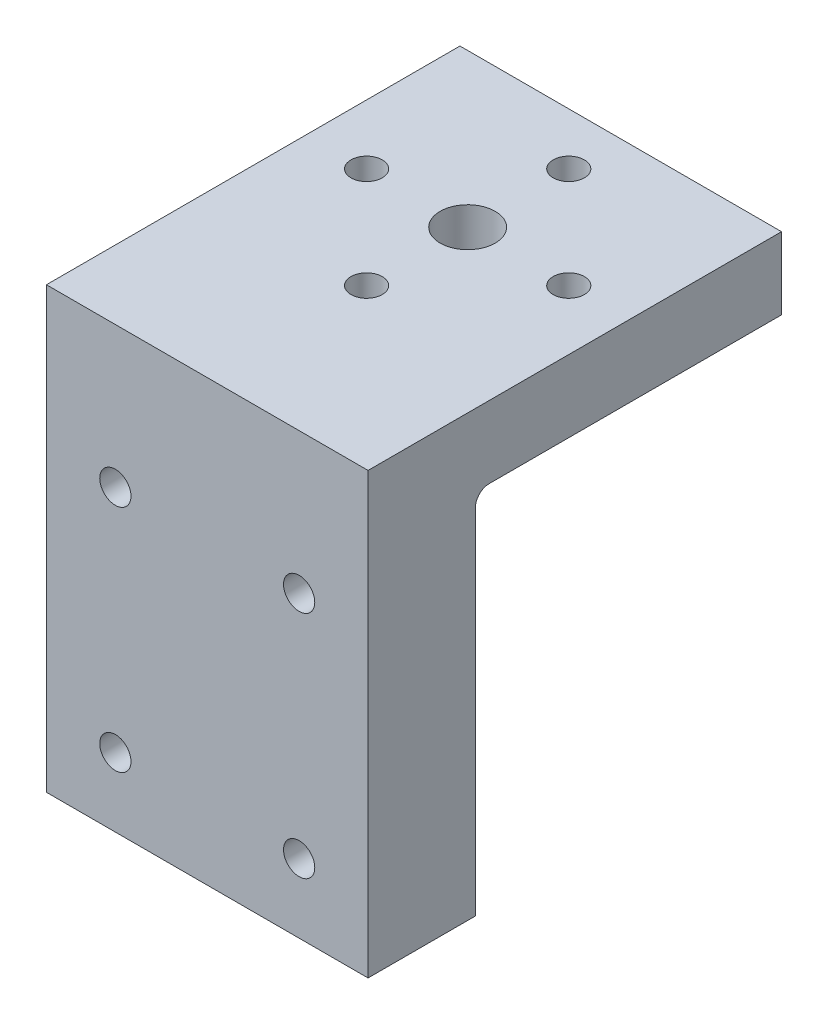
ISO-10303-21;
HEADER;
FILE_DESCRIPTION(('STEP AP214'),'2;1');
FILE_NAME('part.step','',(''),(''),'','','');
FILE_SCHEMA(('AUTOMOTIVE_DESIGN { 1 0 10303 214 1 1 1 1 }'));
ENDSEC;
DATA;
#1=APPLICATION_CONTEXT('core data for automotive mechanical design processes');
#2=APPLICATION_PROTOCOL_DEFINITION('international standard','automotive_design',2000,#1);
#3=PRODUCT_CONTEXT('',#1,'mechanical');
#4=PRODUCT('Part','Part','',(#3));
#5=PRODUCT_RELATED_PRODUCT_CATEGORY('part','',(#4));
#6=PRODUCT_DEFINITION_FORMATION('','',#4);
#7=PRODUCT_DEFINITION_CONTEXT('part definition',#1,'design');
#8=PRODUCT_DEFINITION('design','',#6,#7);
#9=PRODUCT_DEFINITION_SHAPE('','',#8);
#10=(LENGTH_UNIT() NAMED_UNIT(*) SI_UNIT(.MILLI.,.METRE.));
#11=(NAMED_UNIT(*) PLANE_ANGLE_UNIT() SI_UNIT($,.RADIAN.));
#12=(NAMED_UNIT(*) SI_UNIT($,.STERADIAN.) SOLID_ANGLE_UNIT());
#13=UNCERTAINTY_MEASURE_WITH_UNIT(LENGTH_MEASURE(1.E-05),#10,'distance_accuracy_value','');
#14=(GEOMETRIC_REPRESENTATION_CONTEXT(3) GLOBAL_UNCERTAINTY_ASSIGNED_CONTEXT((#13)) GLOBAL_UNIT_ASSIGNED_CONTEXT((#10,
#11,#12)) REPRESENTATION_CONTEXT('',''));
#15=CARTESIAN_POINT('',(0.,0.,0.));
#16=DIRECTION('',(0.,0.,1.));
#17=DIRECTION('',(1.,0.,0.));
#18=AXIS2_PLACEMENT_3D('',#15,#16,#17);
#19=CARTESIAN_POINT('',(17.5,-7.83844459402521,22.5));
#20=DIRECTION('',(1.,0.,0.));
#21=DIRECTION('',(0.,0.,-1.));
#22=AXIS2_PLACEMENT_3D('',#19,#20,#21);
#23=PLANE('',#22);
#24=DIRECTION('',(0.,0.,-1.));
#25=VECTOR('',#24,1.);
#26=CARTESIAN_POINT('',(17.5,0.,22.5));
#27=LINE('',#26,#25);
#28=CARTESIAN_POINT('',(17.5,0.,22.5));
#29=VERTEX_POINT('',#28);
#30=CARTESIAN_POINT('',(17.5,0.,-22.5));
#31=VERTEX_POINT('',#30);
#32=EDGE_CURVE('E133',#29,#31,#27,.T.);
#33=ORIENTED_EDGE('',*,*,#32,.F.);
#34=DIRECTION('',(0.,1.,0.));
#35=VECTOR('',#34,1.);
#36=CARTESIAN_POINT('',(17.5,-7.83844459402521,22.5));
#37=LINE('',#36,#35);
#38=CARTESIAN_POINT('',(17.5,-47.8384445940252,22.5));
#39=VERTEX_POINT('',#38);
#40=EDGE_CURVE('E165',#39,#29,#37,.T.);
#41=ORIENTED_EDGE('',*,*,#40,.F.);
#42=DIRECTION('',(0.,0.,1.));
#43=VECTOR('',#42,1.);
#44=CARTESIAN_POINT('',(17.5,-47.8384445940252,22.5));
#45=LINE('',#44,#43);
#46=CARTESIAN_POINT('',(17.5,-47.8384445940252,10.8151366999293));
#47=VERTEX_POINT('',#46);
#48=EDGE_CURVE('E117',#47,#39,#45,.T.);
#49=ORIENTED_EDGE('',*,*,#48,.F.);
#50=DIRECTION('',(0.,1.,0.));
#51=VECTOR('',#50,1.);
#52=CARTESIAN_POINT('',(17.5,-47.8384445940252,10.8151366999293));
#53=LINE('',#52,#51);
#54=CARTESIAN_POINT('',(17.5,-9.33844459402521,10.8151366999293));
#55=VERTEX_POINT('',#54);
#56=EDGE_CURVE('E112',#47,#55,#53,.T.);
#57=ORIENTED_EDGE('',*,*,#56,.T.);
#58=CARTESIAN_POINT('',(17.5,-9.33844459402521,9.31513669992926));
#59=DIRECTION('',(1.,0.,0.));
#60=DIRECTION('',(0.,0.,-1.));
#61=AXIS2_PLACEMENT_3D('',#58,#59,#60);
#62=CIRCLE('',#61,1.5);
#63=CARTESIAN_POINT('',(17.5,-7.83844459402521,9.31513669992926));
#64=VERTEX_POINT('',#63);
#65=EDGE_CURVE('E55',#55,#64,#62,.F.);
#66=ORIENTED_EDGE('',*,*,#65,.T.);
#67=DIRECTION('',(0.,0.,-1.));
#68=VECTOR('',#67,1.);
#69=CARTESIAN_POINT('',(17.5,-7.83844459402521,22.5));
#70=LINE('',#69,#68);
#71=CARTESIAN_POINT('',(17.5,-7.83844459402521,-22.5));
#72=VERTEX_POINT('',#71);
#73=EDGE_CURVE('E143',#64,#72,#70,.T.);
#74=ORIENTED_EDGE('',*,*,#73,.T.);
#75=DIRECTION('',(0.,1.,0.));
#76=VECTOR('',#75,1.);
#77=CARTESIAN_POINT('',(17.5,-7.83844459402521,-22.5));
#78=LINE('',#77,#76);
#79=EDGE_CURVE('E153',#72,#31,#78,.T.);
#80=ORIENTED_EDGE('',*,*,#79,.T.);
#81=EDGE_LOOP('',(#33,#41,#49,#57,#66,#74,#80));
#82=FACE_BOUND('',#81,.T.);
#83=ADVANCED_FACE('F46',(#82),#23,.T.);
#84=CARTESIAN_POINT('',(-17.5,-7.83844459402521,22.5));
#85=DIRECTION('',(0.,0.,1.));
#86=DIRECTION('',(1.,0.,0.));
#87=AXIS2_PLACEMENT_3D('',#84,#85,#86);
#88=PLANE('',#87);
#89=CARTESIAN_POINT('',(-10.,-40.3384445940252,22.5));
#90=DIRECTION('',(0.,0.,1.));
#91=DIRECTION('',(1.,0.,0.));
#92=AXIS2_PLACEMENT_3D('',#89,#90,#91);
#93=CIRCLE('',#92,1.7);
#94=CARTESIAN_POINT('',(-8.3,-40.3384445940252,22.5));
#95=VERTEX_POINT('',#94);
#96=EDGE_CURVE('E247',#95,#95,#93,.F.);
#97=ORIENTED_EDGE('',*,*,#96,.T.);
#98=EDGE_LOOP('',(#97));
#99=FACE_BOUND('',#98,.T.);
#100=CARTESIAN_POINT('',(10.,-15.3384445940252,22.5));
#101=DIRECTION('',(0.,0.,1.));
#102=DIRECTION('',(1.,0.,0.));
#103=AXIS2_PLACEMENT_3D('',#100,#101,#102);
#104=CIRCLE('',#103,1.7);
#105=CARTESIAN_POINT('',(11.7,-15.3384445940252,22.5));
#106=VERTEX_POINT('',#105);
#107=EDGE_CURVE('E248',#106,#106,#104,.F.);
#108=ORIENTED_EDGE('',*,*,#107,.T.);
#109=EDGE_LOOP('',(#108));
#110=FACE_BOUND('',#109,.T.);
#111=CARTESIAN_POINT('',(-10.,-15.3384445940252,22.5));
#112=DIRECTION('',(0.,0.,1.));
#113=DIRECTION('',(1.,0.,0.));
#114=AXIS2_PLACEMENT_3D('',#111,#112,#113);
#115=CIRCLE('',#114,1.7);
#116=CARTESIAN_POINT('',(-8.3,-15.3384445940252,22.5));
#117=VERTEX_POINT('',#116);
#118=EDGE_CURVE('E262',#117,#117,#115,.F.);
#119=ORIENTED_EDGE('',*,*,#118,.T.);
#120=EDGE_LOOP('',(#119));
#121=FACE_BOUND('',#120,.T.);
#122=CARTESIAN_POINT('',(10.,-40.3384445940252,22.5));
#123=DIRECTION('',(0.,0.,1.));
#124=DIRECTION('',(1.,0.,0.));
#125=AXIS2_PLACEMENT_3D('',#122,#123,#124);
#126=CIRCLE('',#125,1.7);
#127=CARTESIAN_POINT('',(11.7,-40.3384445940252,22.5));
#128=VERTEX_POINT('',#127);
#129=EDGE_CURVE('E228',#128,#128,#126,.F.);
#130=ORIENTED_EDGE('',*,*,#129,.T.);
#131=EDGE_LOOP('',(#130));
#132=FACE_BOUND('',#131,.T.);
#133=DIRECTION('',(1.,0.,0.));
#134=VECTOR('',#133,1.);
#135=CARTESIAN_POINT('',(-17.5,0.,22.5));
#136=LINE('',#135,#134);
#137=CARTESIAN_POINT('',(-17.5,0.,22.5));
#138=VERTEX_POINT('',#137);
#139=EDGE_CURVE('E147',#138,#29,#136,.T.);
#140=ORIENTED_EDGE('',*,*,#139,.F.);
#141=DIRECTION('',(0.,1.,0.));
#142=VECTOR('',#141,1.);
#143=CARTESIAN_POINT('',(-17.5,-7.83844459402521,22.5));
#144=LINE('',#143,#142);
#145=CARTESIAN_POINT('',(-17.5,-47.8384445940252,22.5));
#146=VERTEX_POINT('',#145);
#147=EDGE_CURVE('E169',#146,#138,#144,.T.);
#148=ORIENTED_EDGE('',*,*,#147,.F.);
#149=DIRECTION('',(-1.,0.,0.));
#150=VECTOR('',#149,1.);
#151=CARTESIAN_POINT('',(-17.5,-47.8384445940252,22.5));
#152=LINE('',#151,#150);
#153=EDGE_CURVE('E124',#39,#146,#152,.T.);
#154=ORIENTED_EDGE('',*,*,#153,.F.);
#155=ORIENTED_EDGE('',*,*,#40,.T.);
#156=EDGE_LOOP('',(#140,#148,#154,#155));
#157=FACE_BOUND('',#156,.T.);
#158=ADVANCED_FACE('F267',(#99,#110,#121,#132,#157),#88,.T.);
#159=CARTESIAN_POINT('',(-17.5,-7.83844459402521,22.5));
#160=DIRECTION('',(-1.,0.,0.));
#161=DIRECTION('',(0.,0.,1.));
#162=AXIS2_PLACEMENT_3D('',#159,#160,#161);
#163=PLANE('',#162);
#164=DIRECTION('',(0.,0.,1.));
#165=VECTOR('',#164,1.);
#166=CARTESIAN_POINT('',(-17.5,0.,22.5));
#167=LINE('',#166,#165);
#168=CARTESIAN_POINT('',(-17.5,0.,-22.5));
#169=VERTEX_POINT('',#168);
#170=EDGE_CURVE('E158',#169,#138,#167,.T.);
#171=ORIENTED_EDGE('',*,*,#170,.F.);
#172=DIRECTION('',(0.,1.,0.));
#173=VECTOR('',#172,1.);
#174=CARTESIAN_POINT('',(-17.5,-7.83844459402521,-22.5));
#175=LINE('',#174,#173);
#176=CARTESIAN_POINT('',(-17.5,-7.83844459402521,-22.5));
#177=VERTEX_POINT('',#176);
#178=EDGE_CURVE('E172',#177,#169,#175,.T.);
#179=ORIENTED_EDGE('',*,*,#178,.F.);
#180=DIRECTION('',(0.,0.,1.));
#181=VECTOR('',#180,1.);
#182=CARTESIAN_POINT('',(-17.5,-7.83844459402521,22.5));
#183=LINE('',#182,#181);
#184=CARTESIAN_POINT('',(-17.5,-7.83844459402521,9.31513669992926));
#185=VERTEX_POINT('',#184);
#186=EDGE_CURVE('E151',#177,#185,#183,.T.);
#187=ORIENTED_EDGE('',*,*,#186,.T.);
#188=CARTESIAN_POINT('',(-17.5,-9.33844459402521,9.31513669992926));
#189=DIRECTION('',(-1.,0.,0.));
#190=DIRECTION('',(0.,0.,1.));
#191=AXIS2_PLACEMENT_3D('',#188,#189,#190);
#192=CIRCLE('',#191,1.5);
#193=CARTESIAN_POINT('',(-17.5,-9.33844459402521,10.8151366999293));
#194=VERTEX_POINT('',#193);
#195=EDGE_CURVE('E11',#185,#194,#192,.F.);
#196=ORIENTED_EDGE('',*,*,#195,.T.);
#197=DIRECTION('',(0.,1.,0.));
#198=VECTOR('',#197,1.);
#199=CARTESIAN_POINT('',(-17.5,-47.8384445940252,10.8151366999293));
#200=LINE('',#199,#198);
#201=CARTESIAN_POINT('',(-17.5,-47.8384445940252,10.8151366999293));
#202=VERTEX_POINT('',#201);
#203=EDGE_CURVE('E110',#202,#194,#200,.T.);
#204=ORIENTED_EDGE('',*,*,#203,.F.);
#205=DIRECTION('',(0.,0.,-1.));
#206=VECTOR('',#205,1.);
#207=CARTESIAN_POINT('',(-17.5,-47.8384445940252,22.5));
#208=LINE('',#207,#206);
#209=EDGE_CURVE('E118',#146,#202,#208,.T.);
#210=ORIENTED_EDGE('',*,*,#209,.F.);
#211=ORIENTED_EDGE('',*,*,#147,.T.);
#212=EDGE_LOOP('',(#171,#179,#187,#196,#204,#210,#211));
#213=FACE_BOUND('',#212,.T.);
#214=ADVANCED_FACE('F130',(#213),#163,.T.);
#215=CARTESIAN_POINT('',(-17.5,-7.83844459402521,-22.5));
#216=DIRECTION('',(0.,0.,-1.));
#217=DIRECTION('',(-1.,0.,0.));
#218=AXIS2_PLACEMENT_3D('',#215,#216,#217);
#219=PLANE('',#218);
#220=DIRECTION('',(-1.,0.,0.));
#221=VECTOR('',#220,1.);
#222=CARTESIAN_POINT('',(-17.5,0.,-22.5));
#223=LINE('',#222,#221);
#224=EDGE_CURVE('E138',#31,#169,#223,.T.);
#225=ORIENTED_EDGE('',*,*,#224,.F.);
#226=ORIENTED_EDGE('',*,*,#79,.F.);
#227=DIRECTION('',(-1.,0.,0.));
#228=VECTOR('',#227,1.);
#229=CARTESIAN_POINT('',(-17.5,-7.83844459402521,-22.5));
#230=LINE('',#229,#228);
#231=EDGE_CURVE('E146',#72,#177,#230,.T.);
#232=ORIENTED_EDGE('',*,*,#231,.T.);
#233=ORIENTED_EDGE('',*,*,#178,.T.);
#234=EDGE_LOOP('',(#225,#226,#232,#233));
#235=FACE_BOUND('',#234,.T.);
#236=ADVANCED_FACE('F296',(#235),#219,.T.);
#237=CARTESIAN_POINT('',(0.,-7.83844459402521,0.));
#238=DIRECTION('',(0.,-1.,0.));
#239=DIRECTION('',(0.,0.,-1.));
#240=AXIS2_PLACEMENT_3D('',#237,#238,#239);
#241=PLANE('',#240);
#242=CARTESIAN_POINT('',(0.,-7.83844459402521,5.15756834996463));
#243=DIRECTION('',(0.,-1.,0.));
#244=DIRECTION('',(0.,0.,-1.));
#245=AXIS2_PLACEMENT_3D('',#242,#243,#244);
#246=CIRCLE('',#245,1.7);
#247=CARTESIAN_POINT('',(0.,-7.83844459402521,3.45756834996463));
#248=VERTEX_POINT('',#247);
#249=EDGE_CURVE('E202',#248,#248,#246,.T.);
#250=ORIENTED_EDGE('',*,*,#249,.F.);
#251=EDGE_LOOP('',(#250));
#252=FACE_BOUND('',#251,.T.);
#253=CARTESIAN_POINT('',(11.0000000000001,-7.83844459402521,-5.84243165003525));
#254=DIRECTION('',(0.,-1.,0.));
#255=DIRECTION('',(0.,0.,-1.));
#256=AXIS2_PLACEMENT_3D('',#253,#254,#255);
#257=CIRCLE('',#256,1.7);
#258=CARTESIAN_POINT('',(11.0000000000001,-7.83844459402521,-7.54243165003525));
#259=VERTEX_POINT('',#258);
#260=EDGE_CURVE('E203',#259,#259,#257,.T.);
#261=ORIENTED_EDGE('',*,*,#260,.F.);
#262=EDGE_LOOP('',(#261));
#263=FACE_BOUND('',#262,.T.);
#264=CARTESIAN_POINT('',(2.30437768363647E-13,-7.83844459402521,-16.8424316500354));
#265=DIRECTION('',(0.,-1.,0.));
#266=DIRECTION('',(0.,0.,-1.));
#267=AXIS2_PLACEMENT_3D('',#264,#265,#266);
#268=CIRCLE('',#267,1.7);
#269=CARTESIAN_POINT('',(2.30437768363647E-13,-7.83844459402521,-18.5424316500354));
#270=VERTEX_POINT('',#269);
#271=EDGE_CURVE('E212',#270,#270,#268,.T.);
#272=ORIENTED_EDGE('',*,*,#271,.F.);
#273=EDGE_LOOP('',(#272));
#274=FACE_BOUND('',#273,.T.);
#275=CARTESIAN_POINT('',(-10.9999999999998,-7.83844459402521,-5.84243165003541));
#276=DIRECTION('',(0.,-1.,0.));
#277=DIRECTION('',(0.,0.,-1.));
#278=AXIS2_PLACEMENT_3D('',#275,#276,#277);
#279=CIRCLE('',#278,1.7);
#280=CARTESIAN_POINT('',(-10.9999999999998,-7.83844459402521,-7.54243165003541));
#281=VERTEX_POINT('',#280);
#282=EDGE_CURVE('E219',#281,#281,#279,.T.);
#283=ORIENTED_EDGE('',*,*,#282,.F.);
#284=EDGE_LOOP('',(#283));
#285=FACE_BOUND('',#284,.T.);
#286=CARTESIAN_POINT('',(0.,-7.83844459402521,-5.84243165003537));
#287=DIRECTION('',(0.,-1.,0.));
#288=DIRECTION('',(0.,0.,-1.));
#289=AXIS2_PLACEMENT_3D('',#286,#287,#288);
#290=CIRCLE('',#289,9.);
#291=CARTESIAN_POINT('',(0.,-7.83844459402521,-14.8424316500354));
#292=VERTEX_POINT('',#291);
#293=EDGE_CURVE('E181',#292,#292,#290,.T.);
#294=ORIENTED_EDGE('',*,*,#293,.F.);
#295=EDGE_LOOP('',(#294));
#296=FACE_BOUND('',#295,.T.);
#297=ORIENTED_EDGE('',*,*,#73,.F.);
#298=DIRECTION('',(1.,0.,0.));
#299=VECTOR('',#298,1.);
#300=CARTESIAN_POINT('',(0.,-7.83844459402521,9.31513669992926));
#301=LINE('',#300,#299);
#302=EDGE_CURVE('E68',#64,#185,#301,.F.);
#303=ORIENTED_EDGE('',*,*,#302,.T.);
#304=ORIENTED_EDGE('',*,*,#186,.F.);
#305=ORIENTED_EDGE('',*,*,#231,.F.);
#306=EDGE_LOOP('',(#297,#303,#304,#305));
#307=FACE_BOUND('',#306,.T.);
#308=ADVANCED_FACE('F299',(#252,#263,#274,#285,#296,#307),#241,.T.);
#309=CARTESIAN_POINT('',(0.,0.,0.));
#310=DIRECTION('',(0.,-1.,0.));
#311=DIRECTION('',(0.,0.,-1.));
#312=AXIS2_PLACEMENT_3D('',#309,#310,#311);
#313=PLANE('',#312);
#314=CARTESIAN_POINT('',(0.,0.,5.15756834996463));
#315=DIRECTION('',(0.,-1.,0.));
#316=DIRECTION('',(0.,0.,-1.));
#317=AXIS2_PLACEMENT_3D('',#314,#315,#316);
#318=CIRCLE('',#317,1.7);
#319=CARTESIAN_POINT('',(0.,0.,3.45756834996463));
#320=VERTEX_POINT('',#319);
#321=EDGE_CURVE('E207',#320,#320,#318,.F.);
#322=ORIENTED_EDGE('',*,*,#321,.F.);
#323=EDGE_LOOP('',(#322));
#324=FACE_BOUND('',#323,.T.);
#325=CARTESIAN_POINT('',(11.0000000000001,0.,-5.84243165003525));
#326=DIRECTION('',(0.,-1.,0.));
#327=DIRECTION('',(0.,0.,-1.));
#328=AXIS2_PLACEMENT_3D('',#325,#326,#327);
#329=CIRCLE('',#328,1.7);
#330=CARTESIAN_POINT('',(11.0000000000001,0.,-7.54243165003525));
#331=VERTEX_POINT('',#330);
#332=EDGE_CURVE('E208',#331,#331,#329,.F.);
#333=ORIENTED_EDGE('',*,*,#332,.F.);
#334=EDGE_LOOP('',(#333));
#335=FACE_BOUND('',#334,.T.);
#336=CARTESIAN_POINT('',(2.30437768363647E-13,0.,-16.8424316500354));
#337=DIRECTION('',(0.,-1.,0.));
#338=DIRECTION('',(0.,0.,-1.));
#339=AXIS2_PLACEMENT_3D('',#336,#337,#338);
#340=CIRCLE('',#339,1.7);
#341=CARTESIAN_POINT('',(2.30437768363647E-13,0.,-18.5424316500354));
#342=VERTEX_POINT('',#341);
#343=EDGE_CURVE('E223',#342,#342,#340,.F.);
#344=ORIENTED_EDGE('',*,*,#343,.F.);
#345=EDGE_LOOP('',(#344));
#346=FACE_BOUND('',#345,.T.);
#347=CARTESIAN_POINT('',(-10.9999999999998,0.,-5.84243165003541));
#348=DIRECTION('',(0.,-1.,0.));
#349=DIRECTION('',(0.,0.,-1.));
#350=AXIS2_PLACEMENT_3D('',#347,#348,#349);
#351=CIRCLE('',#350,1.7);
#352=CARTESIAN_POINT('',(-10.9999999999998,0.,-7.54243165003541));
#353=VERTEX_POINT('',#352);
#354=EDGE_CURVE('E224',#353,#353,#351,.F.);
#355=ORIENTED_EDGE('',*,*,#354,.F.);
#356=EDGE_LOOP('',(#355));
#357=FACE_BOUND('',#356,.T.);
#358=CARTESIAN_POINT('',(0.,0.,-5.84243165003537));
#359=DIRECTION('',(0.,-1.,0.));
#360=DIRECTION('',(0.,0.,-1.));
#361=AXIS2_PLACEMENT_3D('',#358,#359,#360);
#362=CIRCLE('',#361,3.);
#363=CARTESIAN_POINT('',(0.,0.,-8.84243165003537));
#364=VERTEX_POINT('',#363);
#365=EDGE_CURVE('E182',#364,#364,#362,.F.);
#366=ORIENTED_EDGE('',*,*,#365,.F.);
#367=EDGE_LOOP('',(#366));
#368=FACE_BOUND('',#367,.T.);
#369=ORIENTED_EDGE('',*,*,#32,.T.);
#370=ORIENTED_EDGE('',*,*,#224,.T.);
#371=ORIENTED_EDGE('',*,*,#170,.T.);
#372=ORIENTED_EDGE('',*,*,#139,.T.);
#373=EDGE_LOOP('',(#369,#370,#371,#372));
#374=FACE_BOUND('',#373,.T.);
#375=ADVANCED_FACE('F302',(#324,#335,#346,#357,#368,#374),#313,.F.);
#376=CARTESIAN_POINT('',(-17.5,-47.8384445940252,10.8151366999293));
#377=DIRECTION('',(0.,0.,1.));
#378=DIRECTION('',(1.,0.,0.));
#379=AXIS2_PLACEMENT_3D('',#376,#377,#378);
#380=PLANE('',#379);
#381=CARTESIAN_POINT('',(-10.,-40.3384445940252,10.8151366999293));
#382=DIRECTION('',(0.,0.,-1.));
#383=DIRECTION('',(-1.,0.,0.));
#384=AXIS2_PLACEMENT_3D('',#381,#382,#383);
#385=CIRCLE('',#384,1.7);
#386=CARTESIAN_POINT('',(-11.7,-40.3384445940252,10.8151366999293));
#387=VERTEX_POINT('',#386);
#388=EDGE_CURVE('E242',#387,#387,#385,.T.);
#389=ORIENTED_EDGE('',*,*,#388,.F.);
#390=EDGE_LOOP('',(#389));
#391=FACE_BOUND('',#390,.T.);
#392=CARTESIAN_POINT('',(10.,-15.3384445940252,10.8151366999293));
#393=DIRECTION('',(0.,0.,-1.));
#394=DIRECTION('',(-1.,0.,0.));
#395=AXIS2_PLACEMENT_3D('',#392,#393,#394);
#396=CIRCLE('',#395,1.7);
#397=CARTESIAN_POINT('',(8.3,-15.3384445940252,10.8151366999293));
#398=VERTEX_POINT('',#397);
#399=EDGE_CURVE('E243',#398,#398,#396,.T.);
#400=ORIENTED_EDGE('',*,*,#399,.F.);
#401=EDGE_LOOP('',(#400));
#402=FACE_BOUND('',#401,.T.);
#403=CARTESIAN_POINT('',(-10.,-15.3384445940252,10.8151366999293));
#404=DIRECTION('',(0.,0.,-1.));
#405=DIRECTION('',(-1.,0.,0.));
#406=AXIS2_PLACEMENT_3D('',#403,#404,#405);
#407=CIRCLE('',#406,1.7);
#408=CARTESIAN_POINT('',(-11.7,-15.3384445940252,10.8151366999293));
#409=VERTEX_POINT('',#408);
#410=EDGE_CURVE('E252',#409,#409,#407,.T.);
#411=ORIENTED_EDGE('',*,*,#410,.F.);
#412=EDGE_LOOP('',(#411));
#413=FACE_BOUND('',#412,.T.);
#414=CARTESIAN_POINT('',(10.,-40.3384445940252,10.8151366999293));
#415=DIRECTION('',(0.,0.,-1.));
#416=DIRECTION('',(-1.,0.,0.));
#417=AXIS2_PLACEMENT_3D('',#414,#415,#416);
#418=CIRCLE('',#417,1.7);
#419=CARTESIAN_POINT('',(8.3,-40.3384445940252,10.8151366999293));
#420=VERTEX_POINT('',#419);
#421=EDGE_CURVE('E238',#420,#420,#418,.T.);
#422=ORIENTED_EDGE('',*,*,#421,.F.);
#423=EDGE_LOOP('',(#422));
#424=FACE_BOUND('',#423,.T.);
#425=ORIENTED_EDGE('',*,*,#203,.T.);
#426=DIRECTION('',(1.,0.,0.));
#427=VECTOR('',#426,1.);
#428=CARTESIAN_POINT('',(-17.5,-9.33844459402521,10.8151366999293));
#429=LINE('',#428,#427);
#430=EDGE_CURVE('E168',#194,#55,#429,.T.);
#431=ORIENTED_EDGE('',*,*,#430,.T.);
#432=ORIENTED_EDGE('',*,*,#56,.F.);
#433=DIRECTION('',(1.,0.,0.));
#434=VECTOR('',#433,1.);
#435=CARTESIAN_POINT('',(-17.5,-47.8384445940252,10.8151366999293));
#436=LINE('',#435,#434);
#437=EDGE_CURVE('E105',#202,#47,#436,.T.);
#438=ORIENTED_EDGE('',*,*,#437,.F.);
#439=EDGE_LOOP('',(#425,#431,#432,#438));
#440=FACE_BOUND('',#439,.T.);
#441=ADVANCED_FACE('F107',(#391,#402,#413,#424,#440),#380,.F.);
#442=CARTESIAN_POINT('',(0.,-47.8384445940252,0.));
#443=DIRECTION('',(0.,-1.,0.));
#444=DIRECTION('',(0.,0.,-1.));
#445=AXIS2_PLACEMENT_3D('',#442,#443,#444);
#446=PLANE('',#445);
#447=ORIENTED_EDGE('',*,*,#209,.T.);
#448=ORIENTED_EDGE('',*,*,#437,.T.);
#449=ORIENTED_EDGE('',*,*,#48,.T.);
#450=ORIENTED_EDGE('',*,*,#153,.T.);
#451=EDGE_LOOP('',(#447,#448,#449,#450));
#452=FACE_BOUND('',#451,.T.);
#453=ADVANCED_FACE('F122',(#452),#446,.T.);
#454=CARTESIAN_POINT('',(0.,-5.83844459402521,-5.84243165003537));
#455=DIRECTION('',(0.,-1.,0.));
#456=DIRECTION('',(0.,0.,-1.));
#457=AXIS2_PLACEMENT_3D('',#454,#455,#456);
#458=CYLINDRICAL_SURFACE('',#457,9.);
#459=CARTESIAN_POINT('',(0.,-5.83844459402521,-5.84243165003537));
#460=DIRECTION('',(0.,-1.,0.));
#461=DIRECTION('',(0.,0.,-1.));
#462=AXIS2_PLACEMENT_3D('',#459,#460,#461);
#463=CIRCLE('',#462,9.);
#464=CARTESIAN_POINT('',(0.,-5.83844459402521,-14.8424316500354));
#465=VERTEX_POINT('',#464);
#466=EDGE_CURVE('E127',#465,#465,#463,.T.);
#467=ORIENTED_EDGE('',*,*,#466,.F.);
#468=EDGE_LOOP('',(#467));
#469=FACE_BOUND('',#468,.T.);
#470=ORIENTED_EDGE('',*,*,#293,.T.);
#471=EDGE_LOOP('',(#470));
#472=FACE_BOUND('',#471,.T.);
#473=ADVANCED_FACE('F314',(#469,#472),#458,.F.);
#474=CARTESIAN_POINT('',(0.,-5.83844459402521,-5.84243165003537));
#475=DIRECTION('',(0.,-1.,0.));
#476=DIRECTION('',(0.,0.,-1.));
#477=AXIS2_PLACEMENT_3D('',#474,#475,#476);
#478=PLANE('',#477);
#479=CARTESIAN_POINT('',(0.,-5.83844459402521,-5.84243165003537));
#480=DIRECTION('',(0.,-1.,0.));
#481=DIRECTION('',(0.,0.,-1.));
#482=AXIS2_PLACEMENT_3D('',#479,#480,#481);
#483=CIRCLE('',#482,3.);
#484=CARTESIAN_POINT('',(0.,-5.83844459402521,-8.84243165003537));
#485=VERTEX_POINT('',#484);
#486=EDGE_CURVE('E177',#485,#485,#483,.T.);
#487=ORIENTED_EDGE('',*,*,#486,.F.);
#488=EDGE_LOOP('',(#487));
#489=FACE_BOUND('',#488,.T.);
#490=ORIENTED_EDGE('',*,*,#466,.T.);
#491=EDGE_LOOP('',(#490));
#492=FACE_BOUND('',#491,.T.);
#493=ADVANCED_FACE('F317',(#489,#492),#478,.T.);
#494=CARTESIAN_POINT('',(0.,8.48528137423857,-5.84243165003537));
#495=DIRECTION('',(0.,-1.,0.));
#496=DIRECTION('',(0.,0.,-1.));
#497=AXIS2_PLACEMENT_3D('',#494,#495,#496);
#498=CYLINDRICAL_SURFACE('',#497,3.);
#499=ORIENTED_EDGE('',*,*,#486,.T.);
#500=EDGE_LOOP('',(#499));
#501=FACE_BOUND('',#500,.T.);
#502=ORIENTED_EDGE('',*,*,#365,.T.);
#503=EDGE_LOOP('',(#502));
#504=FACE_BOUND('',#503,.T.);
#505=ADVANCED_FACE('F321',(#501,#504),#498,.F.);
#506=CARTESIAN_POINT('',(-10.9999999999998,8.48528137423857,-5.84243165003541));
#507=DIRECTION('',(0.,-1.,0.));
#508=DIRECTION('',(0.,0.,-1.));
#509=AXIS2_PLACEMENT_3D('',#506,#507,#508);
#510=CYLINDRICAL_SURFACE('',#509,1.7);
#511=ORIENTED_EDGE('',*,*,#354,.T.);
#512=EDGE_LOOP('',(#511));
#513=FACE_BOUND('',#512,.T.);
#514=ORIENTED_EDGE('',*,*,#282,.T.);
#515=EDGE_LOOP('',(#514));
#516=FACE_BOUND('',#515,.T.);
#517=ADVANCED_FACE('F325',(#513,#516),#510,.F.);
#518=CARTESIAN_POINT('',(2.30437768363647E-13,8.48528137423857,-16.8424316500354));
#519=DIRECTION('',(0.,-1.,0.));
#520=DIRECTION('',(0.,0.,-1.));
#521=AXIS2_PLACEMENT_3D('',#518,#519,#520);
#522=CYLINDRICAL_SURFACE('',#521,1.7);
#523=ORIENTED_EDGE('',*,*,#343,.T.);
#524=EDGE_LOOP('',(#523));
#525=FACE_BOUND('',#524,.T.);
#526=ORIENTED_EDGE('',*,*,#271,.T.);
#527=EDGE_LOOP('',(#526));
#528=FACE_BOUND('',#527,.T.);
#529=ADVANCED_FACE('F330',(#525,#528),#522,.F.);
#530=CARTESIAN_POINT('',(11.0000000000001,8.48528137423857,-5.84243165003525));
#531=DIRECTION('',(0.,-1.,0.));
#532=DIRECTION('',(0.,0.,-1.));
#533=AXIS2_PLACEMENT_3D('',#530,#531,#532);
#534=CYLINDRICAL_SURFACE('',#533,1.7);
#535=ORIENTED_EDGE('',*,*,#332,.T.);
#536=EDGE_LOOP('',(#535));
#537=FACE_BOUND('',#536,.T.);
#538=ORIENTED_EDGE('',*,*,#260,.T.);
#539=EDGE_LOOP('',(#538));
#540=FACE_BOUND('',#539,.T.);
#541=ADVANCED_FACE('F327',(#537,#540),#534,.F.);
#542=CARTESIAN_POINT('',(0.,8.48528137423857,5.15756834996463));
#543=DIRECTION('',(0.,-1.,0.));
#544=DIRECTION('',(0.,0.,-1.));
#545=AXIS2_PLACEMENT_3D('',#542,#543,#544);
#546=CYLINDRICAL_SURFACE('',#545,1.7);
#547=ORIENTED_EDGE('',*,*,#321,.T.);
#548=EDGE_LOOP('',(#547));
#549=FACE_BOUND('',#548,.T.);
#550=ORIENTED_EDGE('',*,*,#249,.T.);
#551=EDGE_LOOP('',(#550));
#552=FACE_BOUND('',#551,.T.);
#553=ADVANCED_FACE('F283',(#549,#552),#546,.F.);
#554=CARTESIAN_POINT('',(10.,-40.3384445940252,27.3083261120685));
#555=DIRECTION('',(0.,0.,-1.));
#556=DIRECTION('',(-1.,0.,0.));
#557=AXIS2_PLACEMENT_3D('',#554,#555,#556);
#558=CYLINDRICAL_SURFACE('',#557,1.7);
#559=ORIENTED_EDGE('',*,*,#421,.T.);
#560=EDGE_LOOP('',(#559));
#561=FACE_BOUND('',#560,.T.);
#562=ORIENTED_EDGE('',*,*,#129,.F.);
#563=EDGE_LOOP('',(#562));
#564=FACE_BOUND('',#563,.T.);
#565=ADVANCED_FACE('F273',(#561,#564),#558,.F.);
#566=CARTESIAN_POINT('',(-10.,-15.3384445940252,27.3083261120685));
#567=DIRECTION('',(0.,0.,-1.));
#568=DIRECTION('',(-1.,0.,0.));
#569=AXIS2_PLACEMENT_3D('',#566,#567,#568);
#570=CYLINDRICAL_SURFACE('',#569,1.7);
#571=ORIENTED_EDGE('',*,*,#410,.T.);
#572=EDGE_LOOP('',(#571));
#573=FACE_BOUND('',#572,.T.);
#574=ORIENTED_EDGE('',*,*,#118,.F.);
#575=EDGE_LOOP('',(#574));
#576=FACE_BOUND('',#575,.T.);
#577=ADVANCED_FACE('F270',(#573,#576),#570,.F.);
#578=CARTESIAN_POINT('',(10.,-15.3384445940252,27.3083261120685));
#579=DIRECTION('',(0.,0.,-1.));
#580=DIRECTION('',(-1.,0.,0.));
#581=AXIS2_PLACEMENT_3D('',#578,#579,#580);
#582=CYLINDRICAL_SURFACE('',#581,1.7);
#583=ORIENTED_EDGE('',*,*,#399,.T.);
#584=EDGE_LOOP('',(#583));
#585=FACE_BOUND('',#584,.T.);
#586=ORIENTED_EDGE('',*,*,#107,.F.);
#587=EDGE_LOOP('',(#586));
#588=FACE_BOUND('',#587,.T.);
#589=ADVANCED_FACE('F272',(#585,#588),#582,.F.);
#590=CARTESIAN_POINT('',(-10.,-40.3384445940252,27.3083261120685));
#591=DIRECTION('',(0.,0.,-1.));
#592=DIRECTION('',(-1.,0.,0.));
#593=AXIS2_PLACEMENT_3D('',#590,#591,#592);
#594=CYLINDRICAL_SURFACE('',#593,1.7);
#595=ORIENTED_EDGE('',*,*,#388,.T.);
#596=EDGE_LOOP('',(#595));
#597=FACE_BOUND('',#596,.T.);
#598=ORIENTED_EDGE('',*,*,#96,.F.);
#599=EDGE_LOOP('',(#598));
#600=FACE_BOUND('',#599,.T.);
#601=ADVANCED_FACE('F280',(#597,#600),#594,.F.);
#602=CARTESIAN_POINT('',(-17.5,-9.33844459402521,9.31513669992926));
#603=DIRECTION('',(1.,0.,0.));
#604=DIRECTION('',(0.,0.,-1.));
#605=AXIS2_PLACEMENT_3D('',#602,#603,#604);
#606=CYLINDRICAL_SURFACE('',#605,1.5);
#607=ORIENTED_EDGE('',*,*,#195,.F.);
#608=ORIENTED_EDGE('',*,*,#302,.F.);
#609=ORIENTED_EDGE('',*,*,#65,.F.);
#610=ORIENTED_EDGE('',*,*,#430,.F.);
#611=EDGE_LOOP('',(#607,#608,#609,#610));
#612=FACE_BOUND('',#611,.T.);
#613=ADVANCED_FACE('F48',(#612),#606,.F.);
#614=CLOSED_SHELL('',(#83,#158,#214,#236,#308,#375,#441,#453,#473,#493,#505,#517,#529,#541,#553,
#565,#577,#589,#601,#613));
#615=MANIFOLD_SOLID_BREP('B2',#614);
#616=ADVANCED_BREP_SHAPE_REPRESENTATION('',(#18,#615),#14);
#617=SHAPE_DEFINITION_REPRESENTATION(#9,#616);
ENDSEC;
END-ISO-10303-21;
